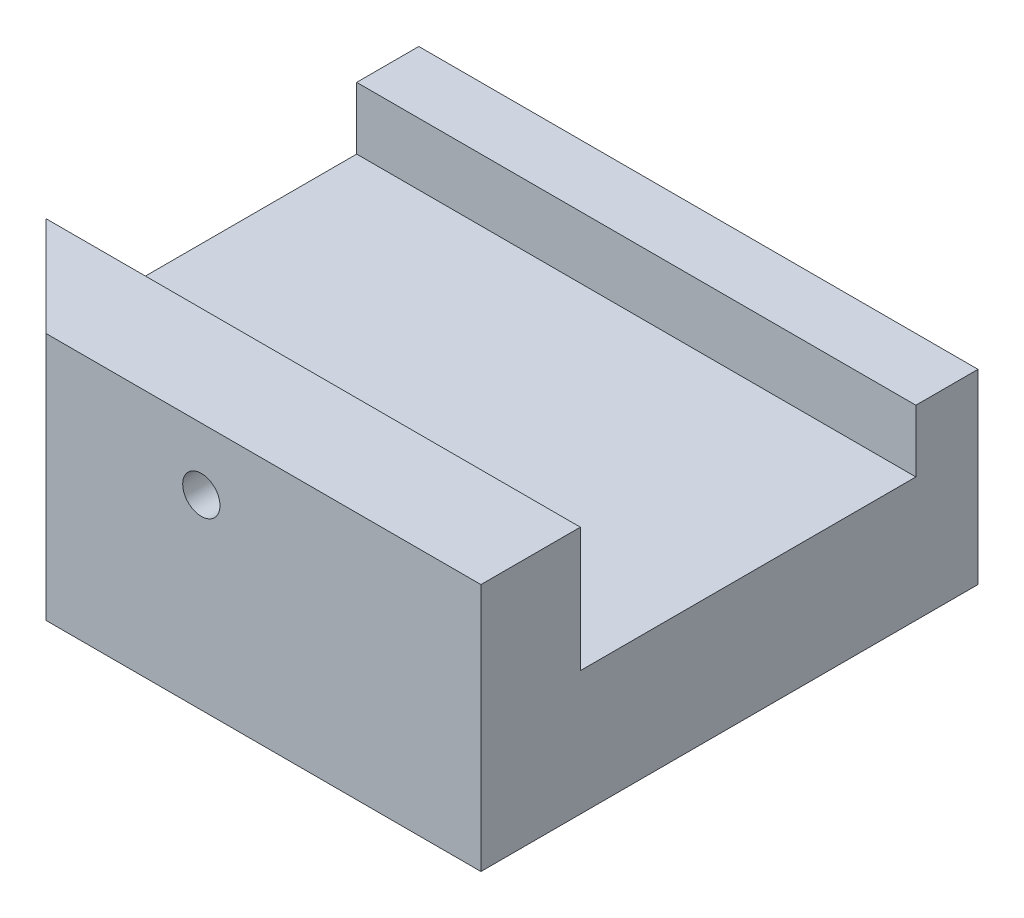
ISO-10303-21;
HEADER;
FILE_DESCRIPTION(('STEP AP214'),'2;1');
FILE_NAME('part.step','',(''),(''),'','','');
FILE_SCHEMA(('AUTOMOTIVE_DESIGN { 1 0 10303 214 1 1 1 1 }'));
ENDSEC;
DATA;
#1=APPLICATION_CONTEXT('core data for automotive mechanical design processes');
#2=APPLICATION_PROTOCOL_DEFINITION('international standard','automotive_design',2000,#1);
#3=PRODUCT_CONTEXT('',#1,'mechanical');
#4=PRODUCT('Part','Part','',(#3));
#5=PRODUCT_RELATED_PRODUCT_CATEGORY('part','',(#4));
#6=PRODUCT_DEFINITION_FORMATION('','',#4);
#7=PRODUCT_DEFINITION_CONTEXT('part definition',#1,'design');
#8=PRODUCT_DEFINITION('design','',#6,#7);
#9=PRODUCT_DEFINITION_SHAPE('','',#8);
#10=(LENGTH_UNIT() NAMED_UNIT(*) SI_UNIT(.MILLI.,.METRE.));
#11=(NAMED_UNIT(*) PLANE_ANGLE_UNIT() SI_UNIT($,.RADIAN.));
#12=(NAMED_UNIT(*) SI_UNIT($,.STERADIAN.) SOLID_ANGLE_UNIT());
#13=UNCERTAINTY_MEASURE_WITH_UNIT(LENGTH_MEASURE(1.E-05),#10,'distance_accuracy_value','');
#14=(GEOMETRIC_REPRESENTATION_CONTEXT(3) GLOBAL_UNCERTAINTY_ASSIGNED_CONTEXT((#13)) GLOBAL_UNIT_ASSIGNED_CONTEXT((#10,
#11,#12)) REPRESENTATION_CONTEXT('',''));
#15=CARTESIAN_POINT('',(0.,0.,0.));
#16=DIRECTION('',(0.,0.,1.));
#17=DIRECTION('',(1.,0.,0.));
#18=AXIS2_PLACEMENT_3D('',#15,#16,#17);
#19=CARTESIAN_POINT('',(22.5,10.,12.));
#20=DIRECTION('',(0.,-1.,0.));
#21=DIRECTION('',(0.,0.,-1.));
#22=AXIS2_PLACEMENT_3D('',#19,#20,#21);
#23=PLANE('',#22);
#24=DIRECTION('',(0.,0.,-1.));
#25=VECTOR('',#24,1.);
#26=CARTESIAN_POINT('',(-22.5,10.,12.));
#27=LINE('',#26,#25);
#28=CARTESIAN_POINT('',(-22.5,10.,9.99999999999996));
#29=VERTEX_POINT('',#28);
#30=CARTESIAN_POINT('',(-22.5,10.,-15.));
#31=VERTEX_POINT('',#30);
#32=EDGE_CURVE('E129',#29,#31,#27,.T.);
#33=ORIENTED_EDGE('',*,*,#32,.F.);
#34=DIRECTION('',(-0.707106781186546,0.,-0.707106781186549));
#35=VECTOR('',#34,1.);
#36=CARTESIAN_POINT('',(-12.5,10.,20.));
#37=LINE('',#36,#35);
#38=CARTESIAN_POINT('',(-20.5,10.,12.));
#39=VERTEX_POINT('',#38);
#40=EDGE_CURVE('E57',#29,#39,#37,.F.);
#41=ORIENTED_EDGE('',*,*,#40,.T.);
#42=DIRECTION('',(-1.,0.,0.));
#43=VECTOR('',#42,1.);
#44=CARTESIAN_POINT('',(22.5,10.,12.));
#45=LINE('',#44,#43);
#46=CARTESIAN_POINT('',(22.5,10.,12.));
#47=VERTEX_POINT('',#46);
#48=EDGE_CURVE('E134',#47,#39,#45,.T.);
#49=ORIENTED_EDGE('',*,*,#48,.F.);
#50=DIRECTION('',(0.,0.,-1.));
#51=VECTOR('',#50,1.);
#52=CARTESIAN_POINT('',(22.5,10.,12.));
#53=LINE('',#52,#51);
#54=CARTESIAN_POINT('',(22.5,10.,-15.));
#55=VERTEX_POINT('',#54);
#56=EDGE_CURVE('E142',#47,#55,#53,.T.);
#57=ORIENTED_EDGE('',*,*,#56,.T.);
#58=DIRECTION('',(1.,0.,0.));
#59=VECTOR('',#58,1.);
#60=CARTESIAN_POINT('',(-22.5,10.,-15.));
#61=LINE('',#60,#59);
#62=EDGE_CURVE('E125',#31,#55,#61,.T.);
#63=ORIENTED_EDGE('',*,*,#62,.F.);
#64=EDGE_LOOP('',(#33,#41,#49,#57,#63));
#65=FACE_BOUND('',#64,.T.);
#66=ADVANCED_FACE('F35',(#65),#23,.F.);
#67=CARTESIAN_POINT('',(0.,20.,0.));
#68=DIRECTION('',(0.,-1.,0.));
#69=DIRECTION('',(0.,0.,-1.));
#70=AXIS2_PLACEMENT_3D('',#67,#68,#69);
#71=PLANE('',#70);
#72=DIRECTION('',(1.,0.,0.));
#73=VECTOR('',#72,1.);
#74=CARTESIAN_POINT('',(22.5,20.,12.));
#75=LINE('',#74,#73);
#76=CARTESIAN_POINT('',(-20.5,20.,12.));
#77=VERTEX_POINT('',#76);
#78=CARTESIAN_POINT('',(22.5,20.,12.));
#79=VERTEX_POINT('',#78);
#80=EDGE_CURVE('E140',#77,#79,#75,.T.);
#81=ORIENTED_EDGE('',*,*,#80,.F.);
#82=DIRECTION('',(-0.707106781186546,0.,-0.707106781186549));
#83=VECTOR('',#82,1.);
#84=CARTESIAN_POINT('',(-12.5,20.,20.));
#85=LINE('',#84,#83);
#86=CARTESIAN_POINT('',(-12.5,20.,20.));
#87=VERTEX_POINT('',#86);
#88=EDGE_CURVE('E11',#77,#87,#85,.F.);
#89=ORIENTED_EDGE('',*,*,#88,.T.);
#90=DIRECTION('',(1.,0.,0.));
#91=VECTOR('',#90,1.);
#92=CARTESIAN_POINT('',(-22.5,20.,20.));
#93=LINE('',#92,#91);
#94=CARTESIAN_POINT('',(22.5,20.,20.));
#95=VERTEX_POINT('',#94);
#96=EDGE_CURVE('E149',#87,#95,#93,.T.);
#97=ORIENTED_EDGE('',*,*,#96,.T.);
#98=DIRECTION('',(0.,0.,-1.));
#99=VECTOR('',#98,1.);
#100=CARTESIAN_POINT('',(22.5,20.,20.));
#101=LINE('',#100,#99);
#102=EDGE_CURVE('E146',#95,#79,#101,.T.);
#103=ORIENTED_EDGE('',*,*,#102,.T.);
#104=EDGE_LOOP('',(#81,#89,#97,#103));
#105=FACE_BOUND('',#104,.T.);
#106=ADVANCED_FACE('F181',(#105),#71,.F.);
#107=CARTESIAN_POINT('',(22.5,20.,20.));
#108=DIRECTION('',(-1.,0.,0.));
#109=DIRECTION('',(0.,0.,1.));
#110=AXIS2_PLACEMENT_3D('',#107,#108,#109);
#111=PLANE('',#110);
#112=DIRECTION('',(0.,-1.,0.));
#113=VECTOR('',#112,1.);
#114=CARTESIAN_POINT('',(22.5,20.,-20.));
#115=LINE('',#114,#113);
#116=CARTESIAN_POINT('',(22.5,15.,-20.));
#117=VERTEX_POINT('',#116);
#118=CARTESIAN_POINT('',(22.5,0.,-20.));
#119=VERTEX_POINT('',#118);
#120=EDGE_CURVE('E165',#117,#119,#115,.T.);
#121=ORIENTED_EDGE('',*,*,#120,.F.);
#122=DIRECTION('',(0.,0.,-1.));
#123=VECTOR('',#122,1.);
#124=CARTESIAN_POINT('',(22.5,15.,-20.));
#125=LINE('',#124,#123);
#126=CARTESIAN_POINT('',(22.5,15.,-15.));
#127=VERTEX_POINT('',#126);
#128=EDGE_CURVE('E116',#127,#117,#125,.T.);
#129=ORIENTED_EDGE('',*,*,#128,.F.);
#130=DIRECTION('',(0.,-1.,0.));
#131=VECTOR('',#130,1.);
#132=CARTESIAN_POINT('',(22.5,15.,-15.));
#133=LINE('',#132,#131);
#134=EDGE_CURVE('E112',#127,#55,#133,.T.);
#135=ORIENTED_EDGE('',*,*,#134,.T.);
#136=ORIENTED_EDGE('',*,*,#56,.F.);
#137=DIRECTION('',(0.,-1.,0.));
#138=VECTOR('',#137,1.);
#139=CARTESIAN_POINT('',(22.5,20.,12.));
#140=LINE('',#139,#138);
#141=EDGE_CURVE('E131',#79,#47,#140,.T.);
#142=ORIENTED_EDGE('',*,*,#141,.F.);
#143=ORIENTED_EDGE('',*,*,#102,.F.);
#144=DIRECTION('',(0.,-1.,0.));
#145=VECTOR('',#144,1.);
#146=CARTESIAN_POINT('',(22.5,20.,20.));
#147=LINE('',#146,#145);
#148=CARTESIAN_POINT('',(22.5,0.,20.));
#149=VERTEX_POINT('',#148);
#150=EDGE_CURVE('E152',#95,#149,#147,.T.);
#151=ORIENTED_EDGE('',*,*,#150,.T.);
#152=DIRECTION('',(0.,0.,-1.));
#153=VECTOR('',#152,1.);
#154=CARTESIAN_POINT('',(22.5,0.,20.));
#155=LINE('',#154,#153);
#156=EDGE_CURVE('E144',#149,#119,#155,.T.);
#157=ORIENTED_EDGE('',*,*,#156,.T.);
#158=EDGE_LOOP('',(#121,#129,#135,#136,#142,#143,#151,#157));
#159=FACE_BOUND('',#158,.T.);
#160=ADVANCED_FACE('F190',(#159),#111,.F.);
#161=CARTESIAN_POINT('',(-22.5,20.,-20.));
#162=DIRECTION('',(0.,0.,1.));
#163=DIRECTION('',(1.,0.,0.));
#164=AXIS2_PLACEMENT_3D('',#161,#162,#163);
#165=PLANE('',#164);
#166=DIRECTION('',(0.,-1.,0.));
#167=VECTOR('',#166,1.);
#168=CARTESIAN_POINT('',(-22.5,20.,-20.));
#169=LINE('',#168,#167);
#170=CARTESIAN_POINT('',(-22.5,15.,-20.));
#171=VERTEX_POINT('',#170);
#172=CARTESIAN_POINT('',(-22.5,0.,-20.));
#173=VERTEX_POINT('',#172);
#174=EDGE_CURVE('E163',#171,#173,#169,.T.);
#175=ORIENTED_EDGE('',*,*,#174,.F.);
#176=DIRECTION('',(-1.,0.,0.));
#177=VECTOR('',#176,1.);
#178=CARTESIAN_POINT('',(-22.5,15.,-20.));
#179=LINE('',#178,#177);
#180=EDGE_CURVE('E123',#117,#171,#179,.T.);
#181=ORIENTED_EDGE('',*,*,#180,.F.);
#182=ORIENTED_EDGE('',*,*,#120,.T.);
#183=DIRECTION('',(-1.,0.,0.));
#184=VECTOR('',#183,1.);
#185=CARTESIAN_POINT('',(-22.5,0.,-20.));
#186=LINE('',#185,#184);
#187=EDGE_CURVE('E155',#119,#173,#186,.T.);
#188=ORIENTED_EDGE('',*,*,#187,.T.);
#189=EDGE_LOOP('',(#175,#181,#182,#188));
#190=FACE_BOUND('',#189,.T.);
#191=ADVANCED_FACE('F233',(#190),#165,.F.);
#192=CARTESIAN_POINT('',(-22.5,20.,20.));
#193=DIRECTION('',(1.,0.,0.));
#194=DIRECTION('',(0.,0.,-1.));
#195=AXIS2_PLACEMENT_3D('',#192,#193,#194);
#196=PLANE('',#195);
#197=DIRECTION('',(0.,0.,1.));
#198=VECTOR('',#197,1.);
#199=CARTESIAN_POINT('',(-22.5,0.,20.));
#200=LINE('',#199,#198);
#201=CARTESIAN_POINT('',(-22.5,0.,9.99999999999996));
#202=VERTEX_POINT('',#201);
#203=EDGE_CURVE('E158',#173,#202,#200,.T.);
#204=ORIENTED_EDGE('',*,*,#203,.T.);
#205=DIRECTION('',(0.,1.,0.));
#206=VECTOR('',#205,1.);
#207=CARTESIAN_POINT('',(-22.5,20.,9.99999999999996));
#208=LINE('',#207,#206);
#209=EDGE_CURVE('E172',#202,#29,#208,.T.);
#210=ORIENTED_EDGE('',*,*,#209,.T.);
#211=ORIENTED_EDGE('',*,*,#32,.T.);
#212=DIRECTION('',(0.,-1.,0.));
#213=VECTOR('',#212,1.);
#214=CARTESIAN_POINT('',(-22.5,15.,-15.));
#215=LINE('',#214,#213);
#216=CARTESIAN_POINT('',(-22.5,15.,-15.));
#217=VERTEX_POINT('',#216);
#218=EDGE_CURVE('E110',#217,#31,#215,.T.);
#219=ORIENTED_EDGE('',*,*,#218,.F.);
#220=DIRECTION('',(0.,0.,1.));
#221=VECTOR('',#220,1.);
#222=CARTESIAN_POINT('',(-22.5,15.,-20.));
#223=LINE('',#222,#221);
#224=EDGE_CURVE('E117',#171,#217,#223,.T.);
#225=ORIENTED_EDGE('',*,*,#224,.F.);
#226=ORIENTED_EDGE('',*,*,#174,.T.);
#227=EDGE_LOOP('',(#204,#210,#211,#219,#225,#226));
#228=FACE_BOUND('',#227,.T.);
#229=ADVANCED_FACE('F128',(#228),#196,.F.);
#230=CARTESIAN_POINT('',(-22.5,20.,20.));
#231=DIRECTION('',(0.,0.,-1.));
#232=DIRECTION('',(-1.,0.,0.));
#233=AXIS2_PLACEMENT_3D('',#230,#231,#232);
#234=PLANE('',#233);
#235=CARTESIAN_POINT('',(0.,15.,20.));
#236=DIRECTION('',(0.,0.,-1.));
#237=DIRECTION('',(-1.,0.,0.));
#238=AXIS2_PLACEMENT_3D('',#235,#236,#237);
#239=CIRCLE('',#238,1.5);
#240=CARTESIAN_POINT('',(-1.50000000000001,15.,20.));
#241=VERTEX_POINT('',#240);
#242=EDGE_CURVE('E193',#241,#241,#239,.T.);
#243=ORIENTED_EDGE('',*,*,#242,.T.);
#244=EDGE_LOOP('',(#243));
#245=FACE_BOUND('',#244,.T.);
#246=ORIENTED_EDGE('',*,*,#96,.F.);
#247=DIRECTION('',(0.,-1.,0.));
#248=VECTOR('',#247,1.);
#249=CARTESIAN_POINT('',(-12.5,20.,20.));
#250=LINE('',#249,#248);
#251=CARTESIAN_POINT('',(-12.5,0.,20.));
#252=VERTEX_POINT('',#251);
#253=EDGE_CURVE('E167',#87,#252,#250,.T.);
#254=ORIENTED_EDGE('',*,*,#253,.T.);
#255=DIRECTION('',(1.,0.,0.));
#256=VECTOR('',#255,1.);
#257=CARTESIAN_POINT('',(-22.5,0.,20.));
#258=LINE('',#257,#256);
#259=EDGE_CURVE('E150',#252,#149,#258,.T.);
#260=ORIENTED_EDGE('',*,*,#259,.T.);
#261=ORIENTED_EDGE('',*,*,#150,.F.);
#262=EDGE_LOOP('',(#246,#254,#260,#261));
#263=FACE_BOUND('',#262,.T.);
#264=ADVANCED_FACE('F184',(#245,#263),#234,.F.);
#265=CARTESIAN_POINT('',(0.,0.,0.));
#266=DIRECTION('',(0.,-1.,0.));
#267=DIRECTION('',(0.,0.,-1.));
#268=AXIS2_PLACEMENT_3D('',#265,#266,#267);
#269=PLANE('',#268);
#270=ORIENTED_EDGE('',*,*,#259,.F.);
#271=DIRECTION('',(0.707106781186546,0.,0.707106781186549));
#272=VECTOR('',#271,1.);
#273=CARTESIAN_POINT('',(-16.25,0.,16.25));
#274=LINE('',#273,#272);
#275=EDGE_CURVE('E170',#252,#202,#274,.F.);
#276=ORIENTED_EDGE('',*,*,#275,.T.);
#277=ORIENTED_EDGE('',*,*,#203,.F.);
#278=ORIENTED_EDGE('',*,*,#187,.F.);
#279=ORIENTED_EDGE('',*,*,#156,.F.);
#280=EDGE_LOOP('',(#270,#276,#277,#278,#279));
#281=FACE_BOUND('',#280,.T.);
#282=ADVANCED_FACE('F211',(#281),#269,.T.);
#283=CARTESIAN_POINT('',(0.,0.,12.));
#284=DIRECTION('',(0.,0.,-1.));
#285=DIRECTION('',(-1.,0.,0.));
#286=AXIS2_PLACEMENT_3D('',#283,#284,#285);
#287=PLANE('',#286);
#288=CARTESIAN_POINT('',(0.,15.,12.));
#289=DIRECTION('',(0.,0.,-1.));
#290=DIRECTION('',(-1.,0.,0.));
#291=AXIS2_PLACEMENT_3D('',#288,#289,#290);
#292=CIRCLE('',#291,1.5);
#293=CARTESIAN_POINT('',(-1.50000000000001,15.,12.));
#294=VERTEX_POINT('',#293);
#295=EDGE_CURVE('E197',#294,#294,#292,.T.);
#296=ORIENTED_EDGE('',*,*,#295,.F.);
#297=EDGE_LOOP('',(#296));
#298=FACE_BOUND('',#297,.T.);
#299=ORIENTED_EDGE('',*,*,#48,.T.);
#300=DIRECTION('',(0.,-1.,0.));
#301=VECTOR('',#300,1.);
#302=CARTESIAN_POINT('',(-20.5,0.,12.));
#303=LINE('',#302,#301);
#304=EDGE_CURVE('E43',#39,#77,#303,.F.);
#305=ORIENTED_EDGE('',*,*,#304,.T.);
#306=ORIENTED_EDGE('',*,*,#80,.T.);
#307=ORIENTED_EDGE('',*,*,#141,.T.);
#308=EDGE_LOOP('',(#299,#305,#306,#307));
#309=FACE_BOUND('',#308,.T.);
#310=ADVANCED_FACE('F192',(#298,#309),#287,.T.);
#311=CARTESIAN_POINT('',(-22.5,15.,-15.));
#312=DIRECTION('',(0.,0.,-1.));
#313=DIRECTION('',(-1.,0.,0.));
#314=AXIS2_PLACEMENT_3D('',#311,#312,#313);
#315=PLANE('',#314);
#316=ORIENTED_EDGE('',*,*,#62,.T.);
#317=ORIENTED_EDGE('',*,*,#134,.F.);
#318=DIRECTION('',(1.,0.,0.));
#319=VECTOR('',#318,1.);
#320=CARTESIAN_POINT('',(-22.5,15.,-15.));
#321=LINE('',#320,#319);
#322=EDGE_CURVE('E105',#217,#127,#321,.T.);
#323=ORIENTED_EDGE('',*,*,#322,.F.);
#324=ORIENTED_EDGE('',*,*,#218,.T.);
#325=EDGE_LOOP('',(#316,#317,#323,#324));
#326=FACE_BOUND('',#325,.T.);
#327=ADVANCED_FACE('F108',(#326),#315,.F.);
#328=CARTESIAN_POINT('',(0.,15.,0.));
#329=DIRECTION('',(0.,1.,0.));
#330=DIRECTION('',(0.,0.,1.));
#331=AXIS2_PLACEMENT_3D('',#328,#329,#330);
#332=PLANE('',#331);
#333=ORIENTED_EDGE('',*,*,#224,.T.);
#334=ORIENTED_EDGE('',*,*,#322,.T.);
#335=ORIENTED_EDGE('',*,*,#128,.T.);
#336=ORIENTED_EDGE('',*,*,#180,.T.);
#337=EDGE_LOOP('',(#333,#334,#335,#336));
#338=FACE_BOUND('',#337,.T.);
#339=ADVANCED_FACE('F121',(#338),#332,.T.);
#340=CARTESIAN_POINT('',(0.,15.,20.));
#341=DIRECTION('',(0.,0.,-1.));
#342=DIRECTION('',(-1.,0.,0.));
#343=AXIS2_PLACEMENT_3D('',#340,#341,#342);
#344=CYLINDRICAL_SURFACE('',#343,1.5);
#345=ORIENTED_EDGE('',*,*,#242,.F.);
#346=EDGE_LOOP('',(#345));
#347=FACE_BOUND('',#346,.T.);
#348=ORIENTED_EDGE('',*,*,#295,.T.);
#349=EDGE_LOOP('',(#348));
#350=FACE_BOUND('',#349,.T.);
#351=ADVANCED_FACE('F204',(#347,#350),#344,.F.);
#352=CARTESIAN_POINT('',(-12.5,20.,20.));
#353=DIRECTION('',(0.707106781186549,0.,-0.707106781186546));
#354=DIRECTION('',(0.,-1.,0.));
#355=AXIS2_PLACEMENT_3D('',#352,#353,#354);
#356=PLANE('',#355);
#357=ORIENTED_EDGE('',*,*,#40,.F.);
#358=ORIENTED_EDGE('',*,*,#209,.F.);
#359=ORIENTED_EDGE('',*,*,#275,.F.);
#360=ORIENTED_EDGE('',*,*,#253,.F.);
#361=ORIENTED_EDGE('',*,*,#88,.F.);
#362=ORIENTED_EDGE('',*,*,#304,.F.);
#363=EDGE_LOOP('',(#357,#358,#359,#360,#361,#362));
#364=FACE_BOUND('',#363,.T.);
#365=ADVANCED_FACE('F37',(#364),#356,.F.);
#366=CLOSED_SHELL('',(#66,#106,#160,#191,#229,#264,#282,#310,#327,#339,#351,#365));
#367=MANIFOLD_SOLID_BREP('B2',#366);
#368=ADVANCED_BREP_SHAPE_REPRESENTATION('',(#18,#367),#14);
#369=SHAPE_DEFINITION_REPRESENTATION(#9,#368);
ENDSEC;
END-ISO-10303-21;
